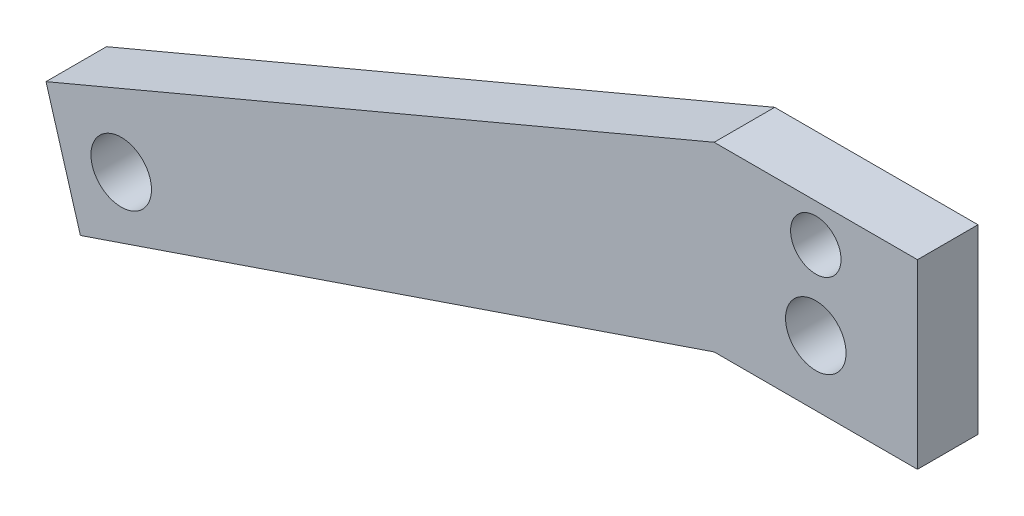
ISO-10303-21;
HEADER;
FILE_DESCRIPTION(('STEP AP214'),'2;1');
FILE_NAME('part.step','',(''),(''),'','','');
FILE_SCHEMA(('AUTOMOTIVE_DESIGN { 1 0 10303 214 1 1 1 1 }'));
ENDSEC;
DATA;
#1=APPLICATION_CONTEXT('core data for automotive mechanical design processes');
#2=APPLICATION_PROTOCOL_DEFINITION('international standard','automotive_design',2000,#1);
#3=PRODUCT_CONTEXT('',#1,'mechanical');
#4=PRODUCT('Part','Part','',(#3));
#5=PRODUCT_RELATED_PRODUCT_CATEGORY('part','',(#4));
#6=PRODUCT_DEFINITION_FORMATION('','',#4);
#7=PRODUCT_DEFINITION_CONTEXT('part definition',#1,'design');
#8=PRODUCT_DEFINITION('design','',#6,#7);
#9=PRODUCT_DEFINITION_SHAPE('','',#8);
#10=(LENGTH_UNIT() NAMED_UNIT(*) SI_UNIT(.MILLI.,.METRE.));
#11=(NAMED_UNIT(*) PLANE_ANGLE_UNIT() SI_UNIT($,.RADIAN.));
#12=(NAMED_UNIT(*) SI_UNIT($,.STERADIAN.) SOLID_ANGLE_UNIT());
#13=UNCERTAINTY_MEASURE_WITH_UNIT(LENGTH_MEASURE(1.E-05),#10,'distance_accuracy_value','');
#14=(GEOMETRIC_REPRESENTATION_CONTEXT(3) GLOBAL_UNCERTAINTY_ASSIGNED_CONTEXT((#13)) GLOBAL_UNIT_ASSIGNED_CONTEXT((#10,
#11,#12)) REPRESENTATION_CONTEXT('',''));
#15=CARTESIAN_POINT('',(0.,0.,0.));
#16=DIRECTION('',(0.,0.,1.));
#17=DIRECTION('',(1.,0.,0.));
#18=AXIS2_PLACEMENT_3D('',#15,#16,#17);
#19=CARTESIAN_POINT('',(-111.181731184165,-32.9335291699961,9.525));
#20=DIRECTION('',(-0.958819734868193,-0.284015344703924,0.));
#21=DIRECTION('',(0.284015344703924,-0.958819734868193,0.));
#22=AXIS2_PLACEMENT_3D('',#19,#20,#21);
#23=PLANE('',#22);
#24=DIRECTION('',(-0.284015344703924,0.958819734868193,0.));
#25=VECTOR('',#24,1.);
#26=CARTESIAN_POINT('',(-111.181731184165,-32.9335291699961,0.));
#27=LINE('',#26,#25);
#28=CARTESIAN_POINT('',(-115.733139183861,-17.5682332698922,0.));
#29=VERTEX_POINT('',#28);
#30=CARTESIAN_POINT('',(-121.143631500471,0.697282679346885,0.));
#31=VERTEX_POINT('',#30);
#32=EDGE_CURVE('E131',#29,#31,#27,.T.);
#33=ORIENTED_EDGE('',*,*,#32,.F.);
#34=DIRECTION('',(0.,0.,-1.));
#35=VECTOR('',#34,1.);
#36=CARTESIAN_POINT('',(-115.733139183861,-17.5682332698922,9.525));
#37=LINE('',#36,#35);
#38=CARTESIAN_POINT('',(-115.733139183861,-17.5682332698922,9.525));
#39=VERTEX_POINT('',#38);
#40=EDGE_CURVE('E11',#39,#29,#37,.T.);
#41=ORIENTED_EDGE('',*,*,#40,.F.);
#42=DIRECTION('',(-0.284015344703924,0.958819734868193,0.));
#43=VECTOR('',#42,1.);
#44=CARTESIAN_POINT('',(-111.181731184165,-32.9335291699961,9.525));
#45=LINE('',#44,#43);
#46=CARTESIAN_POINT('',(-121.143631500471,0.697282679346885,9.525));
#47=VERTEX_POINT('',#46);
#48=EDGE_CURVE('E255',#39,#47,#45,.T.);
#49=ORIENTED_EDGE('',*,*,#48,.T.);
#50=DIRECTION('',(0.,0.,-1.));
#51=VECTOR('',#50,1.);
#52=CARTESIAN_POINT('',(-121.143631500471,0.697282679346885,9.525));
#53=LINE('',#52,#51);
#54=EDGE_CURVE('E81',#47,#31,#53,.T.);
#55=ORIENTED_EDGE('',*,*,#54,.T.);
#56=EDGE_LOOP('',(#33,#41,#49,#55));
#57=FACE_BOUND('',#56,.T.);
#58=ADVANCED_FACE('F36',(#57),#23,.T.);
#59=CARTESIAN_POINT('',(-6.68093946845817,19.6012995194307,9.525));
#60=DIRECTION('',(0.322616747331422,-0.946529679588175,0.));
#61=DIRECTION('',(0.946529679588175,0.322616747331422,0.));
#62=AXIS2_PLACEMENT_3D('',#59,#60,#61);
#63=PLANE('',#62);
#64=DIRECTION('',(-0.946529679588175,-0.322616747331422,0.));
#65=VECTOR('',#64,1.);
#66=CARTESIAN_POINT('',(-6.68093946845817,19.6012995194307,0.));
#67=LINE('',#66,#65);
#68=CARTESIAN_POINT('',(-15.9999937728734,16.4249775796861,0.));
#69=VERTEX_POINT('',#68);
#70=EDGE_CURVE('E129',#69,#29,#67,.T.);
#71=ORIENTED_EDGE('',*,*,#70,.F.);
#72=DIRECTION('',(0.,0.,-1.));
#73=VECTOR('',#72,1.);
#74=CARTESIAN_POINT('',(-15.9999937728734,16.4249775796861,9.525));
#75=LINE('',#74,#73);
#76=CARTESIAN_POINT('',(-15.9999937728734,16.4249775796861,9.525));
#77=VERTEX_POINT('',#76);
#78=EDGE_CURVE('E45',#77,#69,#75,.T.);
#79=ORIENTED_EDGE('',*,*,#78,.F.);
#80=DIRECTION('',(-0.946529679588175,-0.322616747331422,0.));
#81=VECTOR('',#80,1.);
#82=CARTESIAN_POINT('',(-6.68093946845817,19.6012995194307,9.525));
#83=LINE('',#82,#81);
#84=EDGE_CURVE('E256',#77,#39,#83,.T.);
#85=ORIENTED_EDGE('',*,*,#84,.T.);
#86=ORIENTED_EDGE('',*,*,#40,.T.);
#87=EDGE_LOOP('',(#71,#79,#85,#86));
#88=FACE_BOUND('',#87,.T.);
#89=ADVANCED_FACE('F130',(#88),#63,.T.);
#90=CARTESIAN_POINT('',(0.,16.4249775796861,9.525));
#91=DIRECTION('',(0.,-1.,0.));
#92=DIRECTION('',(1.,0.,0.));
#93=AXIS2_PLACEMENT_3D('',#90,#91,#92);
#94=PLANE('',#93);
#95=DIRECTION('',(-1.,0.,0.));
#96=VECTOR('',#95,1.);
#97=CARTESIAN_POINT('',(0.,16.4249775796861,0.));
#98=LINE('',#97,#96);
#99=CARTESIAN_POINT('',(16.0000062271267,16.4249775796861,0.));
#100=VERTEX_POINT('',#99);
#101=EDGE_CURVE('E125',#100,#69,#98,.T.);
#102=ORIENTED_EDGE('',*,*,#101,.F.);
#103=DIRECTION('',(0.,0.,-1.));
#104=VECTOR('',#103,1.);
#105=CARTESIAN_POINT('',(16.0000062271267,16.4249775796861,9.525));
#106=LINE('',#105,#104);
#107=CARTESIAN_POINT('',(16.0000062271267,16.4249775796861,9.525));
#108=VERTEX_POINT('',#107);
#109=EDGE_CURVE('E115',#108,#100,#106,.T.);
#110=ORIENTED_EDGE('',*,*,#109,.F.);
#111=DIRECTION('',(-1.,0.,0.));
#112=VECTOR('',#111,1.);
#113=CARTESIAN_POINT('',(0.,16.4249775796861,9.525));
#114=LINE('',#113,#112);
#115=EDGE_CURVE('E109',#108,#77,#114,.T.);
#116=ORIENTED_EDGE('',*,*,#115,.T.);
#117=ORIENTED_EDGE('',*,*,#78,.T.);
#118=EDGE_LOOP('',(#102,#110,#116,#117));
#119=FACE_BOUND('',#118,.T.);
#120=ADVANCED_FACE('F123',(#119),#94,.T.);
#121=CARTESIAN_POINT('',(16.0000062271267,0.,9.525));
#122=DIRECTION('',(-1.,0.,0.));
#123=DIRECTION('',(0.,-1.,0.));
#124=AXIS2_PLACEMENT_3D('',#121,#122,#123);
#125=PLANE('',#124);
#126=DIRECTION('',(0.,1.,0.));
#127=VECTOR('',#126,1.);
#128=CARTESIAN_POINT('',(16.0000062271267,0.,0.));
#129=LINE('',#128,#127);
#130=CARTESIAN_POINT('',(16.0000062271267,44.9999775796863,0.));
#131=VERTEX_POINT('',#130);
#132=EDGE_CURVE('E114',#100,#131,#129,.T.);
#133=ORIENTED_EDGE('',*,*,#132,.T.);
#134=DIRECTION('',(0.,0.,-1.));
#135=VECTOR('',#134,1.);
#136=CARTESIAN_POINT('',(16.0000062271267,44.9999775796863,9.525));
#137=LINE('',#136,#135);
#138=CARTESIAN_POINT('',(16.0000062271267,44.9999775796863,9.525));
#139=VERTEX_POINT('',#138);
#140=EDGE_CURVE('E99',#139,#131,#137,.T.);
#141=ORIENTED_EDGE('',*,*,#140,.F.);
#142=DIRECTION('',(0.,1.,0.));
#143=VECTOR('',#142,1.);
#144=CARTESIAN_POINT('',(16.0000062271267,0.,9.525));
#145=LINE('',#144,#143);
#146=EDGE_CURVE('E102',#108,#139,#145,.T.);
#147=ORIENTED_EDGE('',*,*,#146,.F.);
#148=ORIENTED_EDGE('',*,*,#109,.T.);
#149=EDGE_LOOP('',(#133,#141,#147,#148));
#150=FACE_BOUND('',#149,.T.);
#151=ADVANCED_FACE('F112',(#150),#125,.F.);
#152=CARTESIAN_POINT('',(0.,44.9999775796863,9.525));
#153=DIRECTION('',(0.,-1.,0.));
#154=DIRECTION('',(0.,0.,-1.));
#155=AXIS2_PLACEMENT_3D('',#152,#153,#154);
#156=PLANE('',#155);
#157=DIRECTION('',(-1.,0.,0.));
#158=VECTOR('',#157,1.);
#159=CARTESIAN_POINT('',(0.,44.9999775796863,0.));
#160=LINE('',#159,#158);
#161=CARTESIAN_POINT('',(-15.9999937728733,44.9999775796863,0.));
#162=VERTEX_POINT('',#161);
#163=EDGE_CURVE('E135',#131,#162,#160,.T.);
#164=ORIENTED_EDGE('',*,*,#163,.T.);
#165=DIRECTION('',(0.,0.,-1.));
#166=VECTOR('',#165,1.);
#167=CARTESIAN_POINT('',(-15.9999937728733,44.9999775796863,9.525));
#168=LINE('',#167,#166);
#169=CARTESIAN_POINT('',(-15.9999937728733,44.9999775796863,9.525));
#170=VERTEX_POINT('',#169);
#171=EDGE_CURVE('E101',#170,#162,#168,.T.);
#172=ORIENTED_EDGE('',*,*,#171,.F.);
#173=DIRECTION('',(-1.,0.,0.));
#174=VECTOR('',#173,1.);
#175=CARTESIAN_POINT('',(0.,44.9999775796863,9.525));
#176=LINE('',#175,#174);
#177=EDGE_CURVE('E94',#139,#170,#176,.T.);
#178=ORIENTED_EDGE('',*,*,#177,.F.);
#179=ORIENTED_EDGE('',*,*,#140,.T.);
#180=EDGE_LOOP('',(#164,#172,#178,#179));
#181=FACE_BOUND('',#180,.T.);
#182=ADVANCED_FACE('F97',(#181),#156,.F.);
#183=CARTESIAN_POINT('',(6.22712671610374E-06,38.9999775796863,9.525));
#184=DIRECTION('',(0.,0.,-1.));
#185=DIRECTION('',(-1.,0.,0.));
#186=AXIS2_PLACEMENT_3D('',#183,#184,#185);
#187=CYLINDRICAL_SURFACE('',#186,3.96875);
#188=CARTESIAN_POINT('',(6.22712671610374E-06,38.9999775796863,9.525));
#189=DIRECTION('',(0.,0.,1.));
#190=DIRECTION('',(1.,0.,0.));
#191=AXIS2_PLACEMENT_3D('',#188,#189,#190);
#192=CIRCLE('',#191,3.96875);
#193=CARTESIAN_POINT('',(-3.96874377287329,38.9999775796863,9.525));
#194=VERTEX_POINT('',#193);
#195=EDGE_CURVE('E257',#194,#194,#192,.T.);
#196=CARTESIAN_POINT('',(6.22712671610374E-06,38.9999775796863,0.));
#197=DIRECTION('',(0.,0.,1.));
#198=DIRECTION('',(1.,0.,0.));
#199=AXIS2_PLACEMENT_3D('',#196,#197,#198);
#200=CIRCLE('',#199,3.96875);
#201=CARTESIAN_POINT('',(-3.96874377287329,38.9999775796863,0.));
#202=VERTEX_POINT('',#201);
#203=EDGE_CURVE('E149',#202,#202,#200,.T.);
#204=CARTESIAN_POINT('',(-3.96874377287329,38.9999775796863,9.525));
#205=CARTESIAN_POINT('',(-3.96874377287329,38.9999775796863,9.42578125));
#206=CARTESIAN_POINT('',(-3.96874377287329,38.9999775796863,9.3265625));
#207=CARTESIAN_POINT('',(-3.96874377287329,38.9999775796863,9.128125));
#208=CARTESIAN_POINT('',(-3.96874377287329,38.9999775796863,9.02890625));
#209=CARTESIAN_POINT('',(-3.96874377287329,38.9999775796863,8.83046875));
#210=CARTESIAN_POINT('',(-3.96874377287329,38.9999775796863,8.73125));
#211=CARTESIAN_POINT('',(-3.96874377287329,38.9999775796863,8.5328125));
#212=CARTESIAN_POINT('',(-3.96874377287329,38.9999775796863,8.43359375));
#213=CARTESIAN_POINT('',(-3.96874377287329,38.9999775796863,8.23515625));
#214=CARTESIAN_POINT('',(-3.96874377287329,38.9999775796863,8.1359375));
#215=CARTESIAN_POINT('',(-3.96874377287329,38.9999775796863,7.9375));
#216=CARTESIAN_POINT('',(-3.96874377287329,38.9999775796863,7.83828125));
#217=CARTESIAN_POINT('',(-3.96874377287329,38.9999775796863,7.63984375));
#218=CARTESIAN_POINT('',(-3.96874377287329,38.9999775796863,7.540625));
#219=CARTESIAN_POINT('',(-3.96874377287329,38.9999775796863,7.3421875));
#220=CARTESIAN_POINT('',(-3.96874377287329,38.9999775796863,7.24296875));
#221=CARTESIAN_POINT('',(-3.96874377287329,38.9999775796863,7.04453125));
#222=CARTESIAN_POINT('',(-3.96874377287329,38.9999775796863,6.9453125));
#223=CARTESIAN_POINT('',(-3.96874377287329,38.9999775796863,6.746875));
#224=CARTESIAN_POINT('',(-3.96874377287329,38.9999775796863,6.64765625));
#225=CARTESIAN_POINT('',(-3.96874377287329,38.9999775796863,6.44921875));
#226=CARTESIAN_POINT('',(-3.96874377287329,38.9999775796863,6.35));
#227=CARTESIAN_POINT('',(-3.96874377287329,38.9999775796863,6.1515625));
#228=CARTESIAN_POINT('',(-3.96874377287329,38.9999775796863,6.05234375));
#229=CARTESIAN_POINT('',(-3.96874377287329,38.9999775796863,5.85390625));
#230=CARTESIAN_POINT('',(-3.96874377287329,38.9999775796863,5.7546875));
#231=CARTESIAN_POINT('',(-3.96874377287329,38.9999775796863,5.55625));
#232=CARTESIAN_POINT('',(-3.96874377287329,38.9999775796863,5.45703125));
#233=CARTESIAN_POINT('',(-3.96874377287329,38.9999775796863,5.25859375));
#234=CARTESIAN_POINT('',(-3.96874377287329,38.9999775796863,5.159375));
#235=CARTESIAN_POINT('',(-3.96874377287329,38.9999775796863,4.9609375));
#236=CARTESIAN_POINT('',(-3.96874377287329,38.9999775796863,4.86171875));
#237=CARTESIAN_POINT('',(-3.96874377287329,38.9999775796863,4.66328125));
#238=CARTESIAN_POINT('',(-3.96874377287329,38.9999775796863,4.5640625));
#239=CARTESIAN_POINT('',(-3.96874377287329,38.9999775796863,4.365625));
#240=CARTESIAN_POINT('',(-3.96874377287329,38.9999775796863,4.26640625));
#241=CARTESIAN_POINT('',(-3.96874377287329,38.9999775796863,4.06796875));
#242=CARTESIAN_POINT('',(-3.96874377287329,38.9999775796863,3.96875));
#243=CARTESIAN_POINT('',(-3.96874377287329,38.9999775796863,3.7703125));
#244=CARTESIAN_POINT('',(-3.96874377287329,38.9999775796863,3.67109375));
#245=CARTESIAN_POINT('',(-3.96874377287329,38.9999775796863,3.47265625));
#246=CARTESIAN_POINT('',(-3.96874377287329,38.9999775796863,3.3734375));
#247=CARTESIAN_POINT('',(-3.96874377287329,38.9999775796863,3.175));
#248=CARTESIAN_POINT('',(-3.96874377287329,38.9999775796863,3.07578125));
#249=CARTESIAN_POINT('',(-3.96874377287329,38.9999775796863,2.87734375));
#250=CARTESIAN_POINT('',(-3.96874377287329,38.9999775796863,2.778125));
#251=CARTESIAN_POINT('',(-3.96874377287329,38.9999775796863,2.5796875));
#252=CARTESIAN_POINT('',(-3.96874377287329,38.9999775796863,2.48046875));
#253=CARTESIAN_POINT('',(-3.96874377287329,38.9999775796863,2.28203125));
#254=CARTESIAN_POINT('',(-3.96874377287329,38.9999775796863,2.1828125));
#255=CARTESIAN_POINT('',(-3.96874377287329,38.9999775796863,1.984375));
#256=CARTESIAN_POINT('',(-3.96874377287329,38.9999775796863,1.88515625));
#257=CARTESIAN_POINT('',(-3.96874377287329,38.9999775796863,1.68671875));
#258=CARTESIAN_POINT('',(-3.96874377287329,38.9999775796863,1.5875));
#259=CARTESIAN_POINT('',(-3.96874377287329,38.9999775796863,1.3890625));
#260=CARTESIAN_POINT('',(-3.96874377287329,38.9999775796863,1.28984375));
#261=CARTESIAN_POINT('',(-3.96874377287329,38.9999775796863,1.09140625));
#262=CARTESIAN_POINT('',(-3.96874377287329,38.9999775796863,0.992187500000001));
#263=CARTESIAN_POINT('',(-3.96874377287329,38.9999775796863,0.793750000000001));
#264=CARTESIAN_POINT('',(-3.96874377287329,38.9999775796863,0.69453125));
#265=CARTESIAN_POINT('',(-3.96874377287329,38.9999775796863,0.49609375));
#266=CARTESIAN_POINT('',(-3.96874377287329,38.9999775796863,0.396875));
#267=CARTESIAN_POINT('',(-3.96874377287329,38.9999775796863,0.1984375));
#268=CARTESIAN_POINT('',(-3.96874377287329,38.9999775796863,0.0992187500000001));
#269=CARTESIAN_POINT('',(-3.96874377287329,38.9999775796863,0.));
#270=B_SPLINE_CURVE_WITH_KNOTS('',3,(#204,#205,#206,#207,#208,#209,#210,#211,#212,#213,#214,
#215,#216,#217,#218,#219,#220,#221,#222,#223,#224,#225,#226,#227,#228,#229,#230,#231,#232,#233,
#234,#235,#236,#237,#238,#239,#240,#241,#242,#243,#244,#245,#246,#247,#248,#249,#250,#251,#252,
#253,#254,#255,#256,#257,#258,#259,#260,#261,#262,#263,#264,#265,#266,#267,#268,#269),
.UNSPECIFIED.,.F.,.F.,(4,2,2,2,2,2,2,2,2,2,2,2,2,2,2,2,2,2,2,2,2,2,2,2,2,2,2,2,2,2,2,2,4),(0.,
0.297656249999998,0.595312499999999,0.892968749999999,1.190625,1.48828125,1.7859375,2.08359375,
2.38125,2.67890625,2.9765625,3.27421875,3.571875,3.86953125,4.1671875,4.46484375,4.7625,
5.06015625,5.3578125,5.65546875,5.953125,6.25078125,6.5484375,6.84609375,7.14375,7.44140625,
7.7390625,8.03671875,8.334375,8.63203125,8.9296875,9.22734375,9.525),.UNSPECIFIED.);
#271=EDGE_CURVE('BSEAM159',#194,#202,#270,.T.);
#272=ORIENTED_EDGE('',*,*,#195,.T.);
#273=ORIENTED_EDGE('',*,*,#203,.F.);
#274=ORIENTED_EDGE('',*,*,#271,.T.);
#275=ORIENTED_EDGE('',*,*,#271,.F.);
#276=EDGE_LOOP('',(#272,#274,#273,#275));
#277=FACE_BOUND('',#276,.T.);
#278=ADVANCED_FACE('F159',(#277),#187,.F.);
#279=CARTESIAN_POINT('',(6.23902837032508E-06,26.6475746126805,9.525));
#280=DIRECTION('',(0.,0.,-1.));
#281=DIRECTION('',(-1.,0.,0.));
#282=AXIS2_PLACEMENT_3D('',#279,#280,#281);
#283=CYLINDRICAL_SURFACE('',#282,4.76250000164186);
#284=CARTESIAN_POINT('',(6.23902837032508E-06,26.6475746126805,9.525));
#285=DIRECTION('',(0.,0.,1.));
#286=DIRECTION('',(1.,0.,0.));
#287=AXIS2_PLACEMENT_3D('',#284,#285,#286);
#288=CIRCLE('',#287,4.76250000164186);
#289=CARTESIAN_POINT('',(-4.76249376261349,26.6475746126805,9.525));
#290=VERTEX_POINT('',#289);
#291=EDGE_CURVE('E173',#290,#290,#288,.T.);
#292=CARTESIAN_POINT('',(6.23902837032508E-06,26.6475746126805,0.));
#293=DIRECTION('',(0.,0.,1.));
#294=DIRECTION('',(1.,0.,0.));
#295=AXIS2_PLACEMENT_3D('',#292,#293,#294);
#296=CIRCLE('',#295,4.76250000164186);
#297=CARTESIAN_POINT('',(-4.76249376261349,26.6475746126805,0.));
#298=VERTEX_POINT('',#297);
#299=EDGE_CURVE('E146',#298,#298,#296,.T.);
#300=CARTESIAN_POINT('',(-4.76249376261349,26.6475746126805,9.525));
#301=CARTESIAN_POINT('',(-4.76249376261349,26.6475746126805,9.42578125));
#302=CARTESIAN_POINT('',(-4.76249376261349,26.6475746126805,9.3265625));
#303=CARTESIAN_POINT('',(-4.76249376261349,26.6475746126805,9.128125));
#304=CARTESIAN_POINT('',(-4.76249376261349,26.6475746126805,9.02890625));
#305=CARTESIAN_POINT('',(-4.76249376261349,26.6475746126805,8.83046875));
#306=CARTESIAN_POINT('',(-4.76249376261349,26.6475746126805,8.73125));
#307=CARTESIAN_POINT('',(-4.76249376261349,26.6475746126805,8.5328125));
#308=CARTESIAN_POINT('',(-4.76249376261349,26.6475746126805,8.43359375));
#309=CARTESIAN_POINT('',(-4.76249376261349,26.6475746126805,8.23515625));
#310=CARTESIAN_POINT('',(-4.76249376261349,26.6475746126805,8.1359375));
#311=CARTESIAN_POINT('',(-4.76249376261349,26.6475746126805,7.9375));
#312=CARTESIAN_POINT('',(-4.76249376261349,26.6475746126805,7.83828125));
#313=CARTESIAN_POINT('',(-4.76249376261349,26.6475746126805,7.63984375));
#314=CARTESIAN_POINT('',(-4.76249376261349,26.6475746126805,7.540625));
#315=CARTESIAN_POINT('',(-4.76249376261349,26.6475746126805,7.3421875));
#316=CARTESIAN_POINT('',(-4.76249376261349,26.6475746126805,7.24296875));
#317=CARTESIAN_POINT('',(-4.76249376261349,26.6475746126805,7.04453125));
#318=CARTESIAN_POINT('',(-4.76249376261349,26.6475746126805,6.9453125));
#319=CARTESIAN_POINT('',(-4.76249376261349,26.6475746126805,6.746875));
#320=CARTESIAN_POINT('',(-4.76249376261349,26.6475746126805,6.64765625));
#321=CARTESIAN_POINT('',(-4.76249376261349,26.6475746126805,6.44921875));
#322=CARTESIAN_POINT('',(-4.76249376261349,26.6475746126805,6.35));
#323=CARTESIAN_POINT('',(-4.76249376261349,26.6475746126805,6.1515625));
#324=CARTESIAN_POINT('',(-4.76249376261349,26.6475746126805,6.05234375));
#325=CARTESIAN_POINT('',(-4.76249376261349,26.6475746126805,5.85390625));
#326=CARTESIAN_POINT('',(-4.76249376261349,26.6475746126805,5.7546875));
#327=CARTESIAN_POINT('',(-4.76249376261349,26.6475746126805,5.55625));
#328=CARTESIAN_POINT('',(-4.76249376261349,26.6475746126805,5.45703125));
#329=CARTESIAN_POINT('',(-4.76249376261349,26.6475746126805,5.25859375));
#330=CARTESIAN_POINT('',(-4.76249376261349,26.6475746126805,5.159375));
#331=CARTESIAN_POINT('',(-4.76249376261349,26.6475746126805,4.9609375));
#332=CARTESIAN_POINT('',(-4.76249376261349,26.6475746126805,4.86171875));
#333=CARTESIAN_POINT('',(-4.76249376261349,26.6475746126805,4.66328125));
#334=CARTESIAN_POINT('',(-4.76249376261349,26.6475746126805,4.5640625));
#335=CARTESIAN_POINT('',(-4.76249376261349,26.6475746126805,4.365625));
#336=CARTESIAN_POINT('',(-4.76249376261349,26.6475746126805,4.26640625));
#337=CARTESIAN_POINT('',(-4.76249376261349,26.6475746126805,4.06796875));
#338=CARTESIAN_POINT('',(-4.76249376261349,26.6475746126805,3.96875));
#339=CARTESIAN_POINT('',(-4.76249376261349,26.6475746126805,3.7703125));
#340=CARTESIAN_POINT('',(-4.76249376261349,26.6475746126805,3.67109375));
#341=CARTESIAN_POINT('',(-4.76249376261349,26.6475746126805,3.47265625));
#342=CARTESIAN_POINT('',(-4.76249376261349,26.6475746126805,3.3734375));
#343=CARTESIAN_POINT('',(-4.76249376261349,26.6475746126805,3.175));
#344=CARTESIAN_POINT('',(-4.76249376261349,26.6475746126805,3.07578125));
#345=CARTESIAN_POINT('',(-4.76249376261349,26.6475746126805,2.87734375));
#346=CARTESIAN_POINT('',(-4.76249376261349,26.6475746126805,2.778125));
#347=CARTESIAN_POINT('',(-4.76249376261349,26.6475746126805,2.5796875));
#348=CARTESIAN_POINT('',(-4.76249376261349,26.6475746126805,2.48046875));
#349=CARTESIAN_POINT('',(-4.76249376261349,26.6475746126805,2.28203125));
#350=CARTESIAN_POINT('',(-4.76249376261349,26.6475746126805,2.1828125));
#351=CARTESIAN_POINT('',(-4.76249376261349,26.6475746126805,1.984375));
#352=CARTESIAN_POINT('',(-4.76249376261349,26.6475746126805,1.88515625));
#353=CARTESIAN_POINT('',(-4.76249376261349,26.6475746126805,1.68671875));
#354=CARTESIAN_POINT('',(-4.76249376261349,26.6475746126805,1.5875));
#355=CARTESIAN_POINT('',(-4.76249376261349,26.6475746126805,1.3890625));
#356=CARTESIAN_POINT('',(-4.76249376261349,26.6475746126805,1.28984375));
#357=CARTESIAN_POINT('',(-4.76249376261349,26.6475746126805,1.09140625));
#358=CARTESIAN_POINT('',(-4.76249376261349,26.6475746126805,0.992187500000001));
#359=CARTESIAN_POINT('',(-4.76249376261349,26.6475746126805,0.793750000000001));
#360=CARTESIAN_POINT('',(-4.76249376261349,26.6475746126805,0.69453125));
#361=CARTESIAN_POINT('',(-4.76249376261349,26.6475746126805,0.49609375));
#362=CARTESIAN_POINT('',(-4.76249376261349,26.6475746126805,0.396875));
#363=CARTESIAN_POINT('',(-4.76249376261349,26.6475746126805,0.1984375));
#364=CARTESIAN_POINT('',(-4.76249376261349,26.6475746126805,0.0992187500000001));
#365=CARTESIAN_POINT('',(-4.76249376261349,26.6475746126805,0.));
#366=B_SPLINE_CURVE_WITH_KNOTS('',3,(#300,#301,#302,#303,#304,#305,#306,#307,#308,#309,#310,
#311,#312,#313,#314,#315,#316,#317,#318,#319,#320,#321,#322,#323,#324,#325,#326,#327,#328,#329,
#330,#331,#332,#333,#334,#335,#336,#337,#338,#339,#340,#341,#342,#343,#344,#345,#346,#347,#348,
#349,#350,#351,#352,#353,#354,#355,#356,#357,#358,#359,#360,#361,#362,#363,#364,#365),
.UNSPECIFIED.,.F.,.F.,(4,2,2,2,2,2,2,2,2,2,2,2,2,2,2,2,2,2,2,2,2,2,2,2,2,2,2,2,2,2,2,2,4),(0.,
0.29765625,0.5953125,0.892968750000001,1.190625,1.48828125,1.7859375,2.08359375,2.38125,
2.67890625,2.9765625,3.27421875,3.571875,3.86953125,4.1671875,4.46484375,4.7625,5.06015625,
5.3578125,5.65546875,5.953125,6.25078125,6.5484375,6.84609375,7.14375,7.44140625,7.7390625,
8.03671875,8.334375,8.63203125,8.9296875,9.22734375,9.525),.UNSPECIFIED.);
#367=EDGE_CURVE('BSEAM161',#290,#298,#366,.T.);
#368=ORIENTED_EDGE('',*,*,#291,.T.);
#369=ORIENTED_EDGE('',*,*,#299,.F.);
#370=ORIENTED_EDGE('',*,*,#367,.T.);
#371=ORIENTED_EDGE('',*,*,#367,.F.);
#372=EDGE_LOOP('',(#368,#370,#369,#371));
#373=FACE_BOUND('',#372,.T.);
#374=ADVANCED_FACE('F161',(#373),#283,.F.);
#375=CARTESIAN_POINT('',(-109.305627367547,-5.73022913696779,9.525));
#376=DIRECTION('',(0.,0.,-1.));
#377=DIRECTION('',(-1.,0.,0.));
#378=AXIS2_PLACEMENT_3D('',#375,#376,#377);
#379=CYLINDRICAL_SURFACE('',#378,4.76250000164186);
#380=CARTESIAN_POINT('',(-109.305627367547,-5.73022913696779,9.525));
#381=DIRECTION('',(0.,0.,1.));
#382=DIRECTION('',(1.,0.,0.));
#383=AXIS2_PLACEMENT_3D('',#380,#381,#382);
#384=CIRCLE('',#383,4.76250000164186);
#385=CARTESIAN_POINT('',(-114.068127369188,-5.73022913696779,9.525));
#386=VERTEX_POINT('',#385);
#387=EDGE_CURVE('E140',#386,#386,#384,.T.);
#388=CARTESIAN_POINT('',(-109.305627367547,-5.73022913696779,0.));
#389=DIRECTION('',(0.,0.,1.));
#390=DIRECTION('',(1.,0.,0.));
#391=AXIS2_PLACEMENT_3D('',#388,#389,#390);
#392=CIRCLE('',#391,4.76250000164186);
#393=CARTESIAN_POINT('',(-114.068127369188,-5.73022913696779,0.));
#394=VERTEX_POINT('',#393);
#395=EDGE_CURVE('E143',#394,#394,#392,.T.);
#396=CARTESIAN_POINT('',(-114.068127369188,-5.73022913696779,9.525));
#397=CARTESIAN_POINT('',(-114.068127369188,-5.73022913696779,9.42578125));
#398=CARTESIAN_POINT('',(-114.068127369188,-5.73022913696779,9.3265625));
#399=CARTESIAN_POINT('',(-114.068127369188,-5.73022913696779,9.128125));
#400=CARTESIAN_POINT('',(-114.068127369188,-5.73022913696779,9.02890625));
#401=CARTESIAN_POINT('',(-114.068127369188,-5.73022913696779,8.83046875));
#402=CARTESIAN_POINT('',(-114.068127369188,-5.73022913696779,8.73125));
#403=CARTESIAN_POINT('',(-114.068127369188,-5.73022913696779,8.5328125));
#404=CARTESIAN_POINT('',(-114.068127369188,-5.73022913696779,8.43359375));
#405=CARTESIAN_POINT('',(-114.068127369188,-5.73022913696779,8.23515625));
#406=CARTESIAN_POINT('',(-114.068127369188,-5.73022913696779,8.1359375));
#407=CARTESIAN_POINT('',(-114.068127369188,-5.73022913696779,7.9375));
#408=CARTESIAN_POINT('',(-114.068127369188,-5.73022913696779,7.83828125));
#409=CARTESIAN_POINT('',(-114.068127369188,-5.73022913696779,7.63984375));
#410=CARTESIAN_POINT('',(-114.068127369188,-5.73022913696779,7.540625));
#411=CARTESIAN_POINT('',(-114.068127369188,-5.73022913696779,7.3421875));
#412=CARTESIAN_POINT('',(-114.068127369188,-5.73022913696779,7.24296875));
#413=CARTESIAN_POINT('',(-114.068127369188,-5.73022913696779,7.04453125));
#414=CARTESIAN_POINT('',(-114.068127369188,-5.73022913696779,6.9453125));
#415=CARTESIAN_POINT('',(-114.068127369188,-5.73022913696779,6.746875));
#416=CARTESIAN_POINT('',(-114.068127369188,-5.73022913696779,6.64765625));
#417=CARTESIAN_POINT('',(-114.068127369188,-5.73022913696779,6.44921875));
#418=CARTESIAN_POINT('',(-114.068127369188,-5.73022913696779,6.35));
#419=CARTESIAN_POINT('',(-114.068127369188,-5.73022913696779,6.1515625));
#420=CARTESIAN_POINT('',(-114.068127369188,-5.73022913696779,6.05234375));
#421=CARTESIAN_POINT('',(-114.068127369188,-5.73022913696779,5.85390625));
#422=CARTESIAN_POINT('',(-114.068127369188,-5.73022913696779,5.7546875));
#423=CARTESIAN_POINT('',(-114.068127369188,-5.73022913696779,5.55625));
#424=CARTESIAN_POINT('',(-114.068127369188,-5.73022913696779,5.45703125));
#425=CARTESIAN_POINT('',(-114.068127369188,-5.73022913696779,5.25859375));
#426=CARTESIAN_POINT('',(-114.068127369188,-5.73022913696779,5.159375));
#427=CARTESIAN_POINT('',(-114.068127369188,-5.73022913696779,4.9609375));
#428=CARTESIAN_POINT('',(-114.068127369188,-5.73022913696779,4.86171875));
#429=CARTESIAN_POINT('',(-114.068127369188,-5.73022913696779,4.66328125));
#430=CARTESIAN_POINT('',(-114.068127369188,-5.73022913696779,4.5640625));
#431=CARTESIAN_POINT('',(-114.068127369188,-5.73022913696779,4.365625));
#432=CARTESIAN_POINT('',(-114.068127369188,-5.73022913696779,4.26640625));
#433=CARTESIAN_POINT('',(-114.068127369188,-5.73022913696779,4.06796875));
#434=CARTESIAN_POINT('',(-114.068127369188,-5.73022913696779,3.96875));
#435=CARTESIAN_POINT('',(-114.068127369188,-5.73022913696779,3.7703125));
#436=CARTESIAN_POINT('',(-114.068127369188,-5.73022913696779,3.67109375));
#437=CARTESIAN_POINT('',(-114.068127369188,-5.73022913696779,3.47265625));
#438=CARTESIAN_POINT('',(-114.068127369188,-5.73022913696779,3.3734375));
#439=CARTESIAN_POINT('',(-114.068127369188,-5.73022913696779,3.175));
#440=CARTESIAN_POINT('',(-114.068127369188,-5.73022913696779,3.07578125));
#441=CARTESIAN_POINT('',(-114.068127369188,-5.73022913696779,2.87734375));
#442=CARTESIAN_POINT('',(-114.068127369188,-5.73022913696779,2.778125));
#443=CARTESIAN_POINT('',(-114.068127369188,-5.73022913696779,2.5796875));
#444=CARTESIAN_POINT('',(-114.068127369188,-5.73022913696779,2.48046875));
#445=CARTESIAN_POINT('',(-114.068127369188,-5.73022913696779,2.28203125));
#446=CARTESIAN_POINT('',(-114.068127369188,-5.73022913696779,2.1828125));
#447=CARTESIAN_POINT('',(-114.068127369188,-5.73022913696779,1.984375));
#448=CARTESIAN_POINT('',(-114.068127369188,-5.73022913696779,1.88515625));
#449=CARTESIAN_POINT('',(-114.068127369188,-5.73022913696779,1.68671875));
#450=CARTESIAN_POINT('',(-114.068127369188,-5.73022913696779,1.5875));
#451=CARTESIAN_POINT('',(-114.068127369188,-5.73022913696779,1.3890625));
#452=CARTESIAN_POINT('',(-114.068127369188,-5.73022913696779,1.28984375));
#453=CARTESIAN_POINT('',(-114.068127369188,-5.73022913696779,1.09140625));
#454=CARTESIAN_POINT('',(-114.068127369188,-5.73022913696779,0.992187500000001));
#455=CARTESIAN_POINT('',(-114.068127369188,-5.73022913696779,0.793750000000001));
#456=CARTESIAN_POINT('',(-114.068127369188,-5.73022913696779,0.69453125));
#457=CARTESIAN_POINT('',(-114.068127369188,-5.73022913696779,0.49609375));
#458=CARTESIAN_POINT('',(-114.068127369188,-5.73022913696779,0.396875));
#459=CARTESIAN_POINT('',(-114.068127369188,-5.73022913696779,0.1984375));
#460=CARTESIAN_POINT('',(-114.068127369188,-5.73022913696779,0.0992187500000001));
#461=CARTESIAN_POINT('',(-114.068127369188,-5.73022913696779,0.));
#462=B_SPLINE_CURVE_WITH_KNOTS('',3,(#396,#397,#398,#399,#400,#401,#402,#403,#404,#405,#406,
#407,#408,#409,#410,#411,#412,#413,#414,#415,#416,#417,#418,#419,#420,#421,#422,#423,#424,#425,
#426,#427,#428,#429,#430,#431,#432,#433,#434,#435,#436,#437,#438,#439,#440,#441,#442,#443,#444,
#445,#446,#447,#448,#449,#450,#451,#452,#453,#454,#455,#456,#457,#458,#459,#460,#461),
.UNSPECIFIED.,.F.,.F.,(4,2,2,2,2,2,2,2,2,2,2,2,2,2,2,2,2,2,2,2,2,2,2,2,2,2,2,2,2,2,2,2,4),(0.,
0.29765625,0.5953125,0.892968750000001,1.190625,1.48828125,1.7859375,2.08359375,2.38125,
2.67890625,2.9765625,3.27421875,3.571875,3.86953125,4.1671875,4.46484375,4.7625,5.06015625,
5.3578125,5.65546875,5.953125,6.25078125,6.5484375,6.84609375,7.14375,7.44140625,7.7390625,
8.03671875,8.334375,8.63203125,8.9296875,9.22734375,9.525),.UNSPECIFIED.);
#463=EDGE_CURVE('BSEAM38',#386,#394,#462,.T.);
#464=ORIENTED_EDGE('',*,*,#387,.T.);
#465=ORIENTED_EDGE('',*,*,#395,.F.);
#466=ORIENTED_EDGE('',*,*,#463,.T.);
#467=ORIENTED_EDGE('',*,*,#463,.F.);
#468=EDGE_LOOP('',(#464,#466,#465,#467));
#469=FACE_BOUND('',#468,.T.);
#470=ADVANCED_FACE('F38',(#469),#379,.F.);
#471=CARTESIAN_POINT('',(-18.5144984661136,43.9404809077269,9.525));
#472=DIRECTION('',(0.388292906680553,-0.921536010485519,0.));
#473=DIRECTION('',(0.921536010485519,0.388292906680553,0.));
#474=AXIS2_PLACEMENT_3D('',#471,#472,#473);
#475=PLANE('',#474);
#476=DIRECTION('',(-0.921536010485519,-0.388292906680553,0.));
#477=VECTOR('',#476,1.);
#478=CARTESIAN_POINT('',(-18.5144984661136,43.9404809077269,0.));
#479=LINE('',#478,#477);
#480=EDGE_CURVE('E74',#162,#31,#479,.T.);
#481=ORIENTED_EDGE('',*,*,#480,.T.);
#482=ORIENTED_EDGE('',*,*,#54,.F.);
#483=DIRECTION('',(-0.921536010485519,-0.388292906680553,0.));
#484=VECTOR('',#483,1.);
#485=CARTESIAN_POINT('',(-18.5144984661136,43.9404809077269,9.525));
#486=LINE('',#485,#484);
#487=EDGE_CURVE('E53',#170,#47,#486,.T.);
#488=ORIENTED_EDGE('',*,*,#487,.F.);
#489=ORIENTED_EDGE('',*,*,#171,.T.);
#490=EDGE_LOOP('',(#481,#482,#488,#489));
#491=FACE_BOUND('',#490,.T.);
#492=ADVANCED_FACE('F168',(#491),#475,.F.);
#493=CARTESIAN_POINT('',(0.,0.,9.525));
#494=DIRECTION('',(0.,0.,1.));
#495=DIRECTION('',(1.,0.,0.));
#496=AXIS2_PLACEMENT_3D('',#493,#494,#495);
#497=PLANE('',#496);
#498=ORIENTED_EDGE('',*,*,#387,.F.);
#499=EDGE_LOOP('',(#498));
#500=FACE_BOUND('',#499,.T.);
#501=ORIENTED_EDGE('',*,*,#291,.F.);
#502=EDGE_LOOP('',(#501));
#503=FACE_BOUND('',#502,.T.);
#504=ORIENTED_EDGE('',*,*,#195,.F.);
#505=EDGE_LOOP('',(#504));
#506=FACE_BOUND('',#505,.T.);
#507=ORIENTED_EDGE('',*,*,#48,.F.);
#508=ORIENTED_EDGE('',*,*,#84,.F.);
#509=ORIENTED_EDGE('',*,*,#115,.F.);
#510=ORIENTED_EDGE('',*,*,#146,.T.);
#511=ORIENTED_EDGE('',*,*,#177,.T.);
#512=ORIENTED_EDGE('',*,*,#487,.T.);
#513=EDGE_LOOP('',(#507,#508,#509,#510,#511,#512));
#514=FACE_BOUND('',#513,.T.);
#515=ADVANCED_FACE('F106',(#500,#503,#506,#514),#497,.T.);
#516=CARTESIAN_POINT('',(0.,0.,0.));
#517=DIRECTION('',(0.,0.,1.));
#518=DIRECTION('',(1.,0.,0.));
#519=AXIS2_PLACEMENT_3D('',#516,#517,#518);
#520=PLANE('',#519);
#521=ORIENTED_EDGE('',*,*,#395,.T.);
#522=EDGE_LOOP('',(#521));
#523=FACE_BOUND('',#522,.T.);
#524=ORIENTED_EDGE('',*,*,#299,.T.);
#525=EDGE_LOOP('',(#524));
#526=FACE_BOUND('',#525,.T.);
#527=ORIENTED_EDGE('',*,*,#203,.T.);
#528=EDGE_LOOP('',(#527));
#529=FACE_BOUND('',#528,.T.);
#530=ORIENTED_EDGE('',*,*,#32,.T.);
#531=ORIENTED_EDGE('',*,*,#480,.F.);
#532=ORIENTED_EDGE('',*,*,#163,.F.);
#533=ORIENTED_EDGE('',*,*,#132,.F.);
#534=ORIENTED_EDGE('',*,*,#101,.T.);
#535=ORIENTED_EDGE('',*,*,#70,.T.);
#536=EDGE_LOOP('',(#530,#531,#532,#533,#534,#535));
#537=FACE_BOUND('',#536,.T.);
#538=ADVANCED_FACE('F133',(#523,#526,#529,#537),#520,.F.);
#539=CLOSED_SHELL('',(#58,#89,#120,#151,#182,#278,#374,#470,#492,#515,#538));
#540=MANIFOLD_SOLID_BREP('B2',#539);
#541=ADVANCED_BREP_SHAPE_REPRESENTATION('',(#18,#540),#14);
#542=SHAPE_DEFINITION_REPRESENTATION(#9,#541);
ENDSEC;
END-ISO-10303-21;
